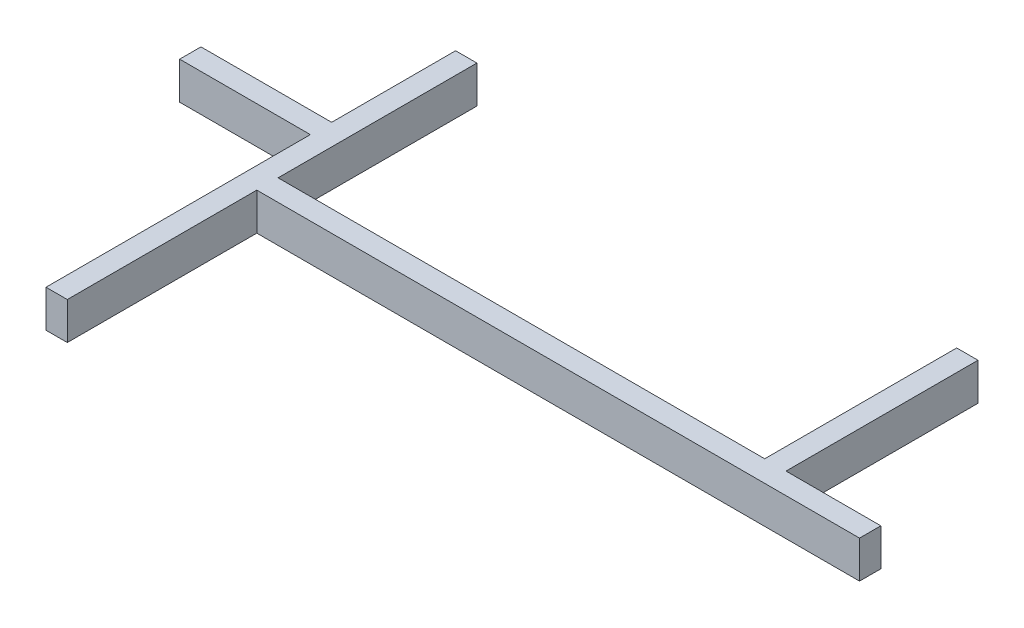
ISO-10303-21;
HEADER;
FILE_DESCRIPTION(('STEP AP214'),'2;1');
FILE_NAME('part.step','',(''),(''),'','','');
FILE_SCHEMA(('AUTOMOTIVE_DESIGN { 1 0 10303 214 1 1 1 1 }'));
ENDSEC;
DATA;
#1=APPLICATION_CONTEXT('core data for automotive mechanical design processes');
#2=APPLICATION_PROTOCOL_DEFINITION('international standard','automotive_design',2000,#1);
#3=PRODUCT_CONTEXT('',#1,'mechanical');
#4=PRODUCT('Part','Part','',(#3));
#5=PRODUCT_RELATED_PRODUCT_CATEGORY('part','',(#4));
#6=PRODUCT_DEFINITION_FORMATION('','',#4);
#7=PRODUCT_DEFINITION_CONTEXT('part definition',#1,'design');
#8=PRODUCT_DEFINITION('design','',#6,#7);
#9=PRODUCT_DEFINITION_SHAPE('','',#8);
#10=(LENGTH_UNIT() NAMED_UNIT(*) SI_UNIT(.MILLI.,.METRE.));
#11=(NAMED_UNIT(*) PLANE_ANGLE_UNIT() SI_UNIT($,.RADIAN.));
#12=(NAMED_UNIT(*) SI_UNIT($,.STERADIAN.) SOLID_ANGLE_UNIT());
#13=UNCERTAINTY_MEASURE_WITH_UNIT(LENGTH_MEASURE(1.E-05),#10,'distance_accuracy_value','');
#14=(GEOMETRIC_REPRESENTATION_CONTEXT(3) GLOBAL_UNCERTAINTY_ASSIGNED_CONTEXT((#13)) GLOBAL_UNIT_ASSIGNED_CONTEXT((#10,
#11,#12)) REPRESENTATION_CONTEXT('',''));
#15=CARTESIAN_POINT('',(0.,0.,0.));
#16=DIRECTION('',(0.,0.,1.));
#17=DIRECTION('',(1.,0.,0.));
#18=AXIS2_PLACEMENT_3D('',#15,#16,#17);
#19=CARTESIAN_POINT('',(69.8278514513272,8.5,104.418377476032));
#20=DIRECTION('',(0.,0.,-1.));
#21=DIRECTION('',(-1.,0.,0.));
#22=AXIS2_PLACEMENT_3D('',#19,#20,#21);
#23=PLANE('',#22);
#24=DIRECTION('',(1.,0.,0.));
#25=VECTOR('',#24,1.);
#26=CARTESIAN_POINT('',(69.8278514513272,1.5,104.418377476032));
#27=LINE('',#26,#25);
#28=CARTESIAN_POINT('',(-43.3451154340158,1.5,104.418377476032));
#29=VERTEX_POINT('',#28);
#30=CARTESIAN_POINT('',(69.8278514513272,1.5,104.418377476032));
#31=VERTEX_POINT('',#30);
#32=EDGE_CURVE('E252',#29,#31,#27,.T.);
#33=ORIENTED_EDGE('',*,*,#32,.T.);
#34=DIRECTION('',(0.,-1.,0.));
#35=VECTOR('',#34,1.);
#36=CARTESIAN_POINT('',(69.8278514513272,8.5,104.418377476032));
#37=LINE('',#36,#35);
#38=CARTESIAN_POINT('',(69.8278514513272,8.5,104.418377476032));
#39=VERTEX_POINT('',#38);
#40=EDGE_CURVE('E212',#39,#31,#37,.T.);
#41=ORIENTED_EDGE('',*,*,#40,.F.);
#42=DIRECTION('',(1.,0.,0.));
#43=VECTOR('',#42,1.);
#44=CARTESIAN_POINT('',(69.8278514513272,8.5,104.418377476032));
#45=LINE('',#44,#43);
#46=CARTESIAN_POINT('',(-43.3451154340158,8.5,104.418377476032));
#47=VERTEX_POINT('',#46);
#48=EDGE_CURVE('E222',#47,#39,#45,.T.);
#49=ORIENTED_EDGE('',*,*,#48,.F.);
#50=DIRECTION('',(0.,-1.,0.));
#51=VECTOR('',#50,1.);
#52=CARTESIAN_POINT('',(-43.3451154340158,8.5,104.418377476032));
#53=LINE('',#52,#51);
#54=EDGE_CURVE('E215',#47,#29,#53,.T.);
#55=ORIENTED_EDGE('',*,*,#54,.T.);
#56=EDGE_LOOP('',(#33,#41,#49,#55));
#57=FACE_BOUND('',#56,.T.);
#58=ADVANCED_FACE('F45',(#57),#23,.F.);
#59=CARTESIAN_POINT('',(69.8278514513266,8.5,100.418377476032));
#60=DIRECTION('',(-1.,0.,1.31838984174237E-13));
#61=DIRECTION('',(1.31838984174237E-13,0.,1.));
#62=AXIS2_PLACEMENT_3D('',#59,#60,#61);
#63=PLANE('',#62);
#64=DIRECTION('',(-1.31838984174237E-13,0.,-1.));
#65=VECTOR('',#64,1.);
#66=CARTESIAN_POINT('',(69.8278514513266,1.5,100.418377476032));
#67=LINE('',#66,#65);
#68=CARTESIAN_POINT('',(69.8278514513266,1.5,100.418377476032));
#69=VERTEX_POINT('',#68);
#70=EDGE_CURVE('E255',#31,#69,#67,.T.);
#71=ORIENTED_EDGE('',*,*,#70,.T.);
#72=DIRECTION('',(0.,-1.,0.));
#73=VECTOR('',#72,1.);
#74=CARTESIAN_POINT('',(69.8278514513266,8.5,100.418377476032));
#75=LINE('',#74,#73);
#76=CARTESIAN_POINT('',(69.8278514513266,8.5,100.418377476032));
#77=VERTEX_POINT('',#76);
#78=EDGE_CURVE('E209',#77,#69,#75,.T.);
#79=ORIENTED_EDGE('',*,*,#78,.F.);
#80=DIRECTION('',(-1.31838984174237E-13,0.,-1.));
#81=VECTOR('',#80,1.);
#82=CARTESIAN_POINT('',(69.8278514513266,8.5,100.418377476032));
#83=LINE('',#82,#81);
#84=EDGE_CURVE('E228',#39,#77,#83,.T.);
#85=ORIENTED_EDGE('',*,*,#84,.F.);
#86=ORIENTED_EDGE('',*,*,#40,.T.);
#87=EDGE_LOOP('',(#71,#79,#85,#86));
#88=FACE_BOUND('',#87,.T.);
#89=ADVANCED_FACE('F332',(#88),#63,.F.);
#90=CARTESIAN_POINT('',(52.0277518293071,8.5,100.418377476032));
#91=DIRECTION('',(0.,0.,1.));
#92=DIRECTION('',(1.,0.,0.));
#93=AXIS2_PLACEMENT_3D('',#90,#91,#92);
#94=PLANE('',#93);
#95=DIRECTION('',(-1.,0.,0.));
#96=VECTOR('',#95,1.);
#97=CARTESIAN_POINT('',(52.0277518293071,1.5,100.418377476032));
#98=LINE('',#97,#96);
#99=CARTESIAN_POINT('',(52.0277518293071,1.5,100.418377476032));
#100=VERTEX_POINT('',#99);
#101=EDGE_CURVE('E258',#69,#100,#98,.T.);
#102=ORIENTED_EDGE('',*,*,#101,.T.);
#103=DIRECTION('',(0.,-1.,0.));
#104=VECTOR('',#103,1.);
#105=CARTESIAN_POINT('',(52.0277518293071,8.5,100.418377476032));
#106=LINE('',#105,#104);
#107=CARTESIAN_POINT('',(52.0277518293071,8.5,100.418377476032));
#108=VERTEX_POINT('',#107);
#109=EDGE_CURVE('E206',#108,#100,#106,.T.);
#110=ORIENTED_EDGE('',*,*,#109,.F.);
#111=DIRECTION('',(-1.,0.,0.));
#112=VECTOR('',#111,1.);
#113=CARTESIAN_POINT('',(52.0277518293071,8.5,100.418377476032));
#114=LINE('',#113,#112);
#115=EDGE_CURVE('E230',#77,#108,#114,.T.);
#116=ORIENTED_EDGE('',*,*,#115,.F.);
#117=ORIENTED_EDGE('',*,*,#78,.T.);
#118=EDGE_LOOP('',(#102,#110,#116,#117));
#119=FACE_BOUND('',#118,.T.);
#120=ADVANCED_FACE('F329',(#119),#94,.F.);
#121=CARTESIAN_POINT('',(52.0277518293071,8.5,64.3719394552487));
#122=DIRECTION('',(-1.,0.,0.));
#123=DIRECTION('',(0.,0.,1.));
#124=AXIS2_PLACEMENT_3D('',#121,#122,#123);
#125=PLANE('',#124);
#126=DIRECTION('',(0.,0.,-1.));
#127=VECTOR('',#126,1.);
#128=CARTESIAN_POINT('',(52.0277518293071,1.5,64.3719394552487));
#129=LINE('',#128,#127);
#130=CARTESIAN_POINT('',(52.0277518293071,1.5,64.3719394552487));
#131=VERTEX_POINT('',#130);
#132=EDGE_CURVE('E261',#100,#131,#129,.T.);
#133=ORIENTED_EDGE('',*,*,#132,.T.);
#134=DIRECTION('',(0.,-1.,0.));
#135=VECTOR('',#134,1.);
#136=CARTESIAN_POINT('',(52.0277518293071,8.5,64.3719394552487));
#137=LINE('',#136,#135);
#138=CARTESIAN_POINT('',(52.0277518293071,8.5,64.3719394552487));
#139=VERTEX_POINT('',#138);
#140=EDGE_CURVE('E203',#139,#131,#137,.T.);
#141=ORIENTED_EDGE('',*,*,#140,.F.);
#142=DIRECTION('',(0.,0.,-1.));
#143=VECTOR('',#142,1.);
#144=CARTESIAN_POINT('',(52.0277518293071,8.5,64.3719394552487));
#145=LINE('',#144,#143);
#146=EDGE_CURVE('E232',#108,#139,#145,.T.);
#147=ORIENTED_EDGE('',*,*,#146,.F.);
#148=ORIENTED_EDGE('',*,*,#109,.T.);
#149=EDGE_LOOP('',(#133,#141,#147,#148));
#150=FACE_BOUND('',#149,.T.);
#151=ADVANCED_FACE('F324',(#150),#125,.F.);
#152=CARTESIAN_POINT('',(48.0277518293071,8.5,64.3719394552487));
#153=DIRECTION('',(0.,0.,1.));
#154=DIRECTION('',(1.,0.,0.));
#155=AXIS2_PLACEMENT_3D('',#152,#153,#154);
#156=PLANE('',#155);
#157=DIRECTION('',(-1.,0.,0.));
#158=VECTOR('',#157,1.);
#159=CARTESIAN_POINT('',(48.0277518293071,1.5,64.3719394552487));
#160=LINE('',#159,#158);
#161=CARTESIAN_POINT('',(48.0277518293071,1.5,64.3719394552487));
#162=VERTEX_POINT('',#161);
#163=EDGE_CURVE('E264',#131,#162,#160,.T.);
#164=ORIENTED_EDGE('',*,*,#163,.T.);
#165=DIRECTION('',(0.,-1.,0.));
#166=VECTOR('',#165,1.);
#167=CARTESIAN_POINT('',(48.0277518293071,8.5,64.3719394552487));
#168=LINE('',#167,#166);
#169=CARTESIAN_POINT('',(48.0277518293071,8.5,64.3719394552487));
#170=VERTEX_POINT('',#169);
#171=EDGE_CURVE('E200',#170,#162,#168,.T.);
#172=ORIENTED_EDGE('',*,*,#171,.F.);
#173=DIRECTION('',(-1.,0.,0.));
#174=VECTOR('',#173,1.);
#175=CARTESIAN_POINT('',(48.0277518293071,8.5,64.3719394552487));
#176=LINE('',#175,#174);
#177=EDGE_CURVE('E234',#139,#170,#176,.T.);
#178=ORIENTED_EDGE('',*,*,#177,.F.);
#179=ORIENTED_EDGE('',*,*,#140,.T.);
#180=EDGE_LOOP('',(#164,#172,#178,#179));
#181=FACE_BOUND('',#180,.T.);
#182=ADVANCED_FACE('F321',(#181),#156,.F.);
#183=CARTESIAN_POINT('',(48.0277518293071,8.5,100.418377476032));
#184=DIRECTION('',(1.,0.,0.));
#185=DIRECTION('',(0.,0.,-1.));
#186=AXIS2_PLACEMENT_3D('',#183,#184,#185);
#187=PLANE('',#186);
#188=DIRECTION('',(0.,0.,1.));
#189=VECTOR('',#188,1.);
#190=CARTESIAN_POINT('',(48.0277518293071,1.5,100.418377476032));
#191=LINE('',#190,#189);
#192=CARTESIAN_POINT('',(48.0277518293071,1.5,100.418377476032));
#193=VERTEX_POINT('',#192);
#194=EDGE_CURVE('E267',#162,#193,#191,.T.);
#195=ORIENTED_EDGE('',*,*,#194,.T.);
#196=DIRECTION('',(0.,-1.,0.));
#197=VECTOR('',#196,1.);
#198=CARTESIAN_POINT('',(48.0277518293071,8.5,100.418377476032));
#199=LINE('',#198,#197);
#200=CARTESIAN_POINT('',(48.0277518293071,8.5,100.418377476032));
#201=VERTEX_POINT('',#200);
#202=EDGE_CURVE('E197',#201,#193,#199,.T.);
#203=ORIENTED_EDGE('',*,*,#202,.F.);
#204=DIRECTION('',(0.,0.,1.));
#205=VECTOR('',#204,1.);
#206=CARTESIAN_POINT('',(48.0277518293071,8.5,100.418377476032));
#207=LINE('',#206,#205);
#208=EDGE_CURVE('E236',#170,#201,#207,.T.);
#209=ORIENTED_EDGE('',*,*,#208,.F.);
#210=ORIENTED_EDGE('',*,*,#171,.T.);
#211=EDGE_LOOP('',(#195,#203,#209,#210));
#212=FACE_BOUND('',#211,.T.);
#213=ADVANCED_FACE('F316',(#212),#187,.F.);
#214=CARTESIAN_POINT('',(-43.3451154340158,8.5,100.418377476032));
#215=DIRECTION('',(0.,0.,1.));
#216=DIRECTION('',(1.,0.,0.));
#217=AXIS2_PLACEMENT_3D('',#214,#215,#216);
#218=PLANE('',#217);
#219=DIRECTION('',(-1.,0.,0.));
#220=VECTOR('',#219,1.);
#221=CARTESIAN_POINT('',(-43.3451154340158,1.5,100.418377476032));
#222=LINE('',#221,#220);
#223=CARTESIAN_POINT('',(-43.3451154340158,1.5,100.418377476032));
#224=VERTEX_POINT('',#223);
#225=EDGE_CURVE('E270',#193,#224,#222,.T.);
#226=ORIENTED_EDGE('',*,*,#225,.T.);
#227=DIRECTION('',(0.,-1.,0.));
#228=VECTOR('',#227,1.);
#229=CARTESIAN_POINT('',(-43.3451154340158,8.5,100.418377476032));
#230=LINE('',#229,#228);
#231=CARTESIAN_POINT('',(-43.3451154340158,8.5,100.418377476032));
#232=VERTEX_POINT('',#231);
#233=EDGE_CURVE('E194',#232,#224,#230,.T.);
#234=ORIENTED_EDGE('',*,*,#233,.F.);
#235=DIRECTION('',(-1.,0.,0.));
#236=VECTOR('',#235,1.);
#237=CARTESIAN_POINT('',(-43.3451154340158,8.5,100.418377476032));
#238=LINE('',#237,#236);
#239=EDGE_CURVE('E238',#201,#232,#238,.T.);
#240=ORIENTED_EDGE('',*,*,#239,.F.);
#241=ORIENTED_EDGE('',*,*,#202,.T.);
#242=EDGE_LOOP('',(#226,#234,#240,#241));
#243=FACE_BOUND('',#242,.T.);
#244=ADVANCED_FACE('F313',(#243),#218,.F.);
#245=CARTESIAN_POINT('',(-43.3451154340158,8.5,63.0885592077101));
#246=DIRECTION('',(-1.,0.,0.));
#247=DIRECTION('',(0.,0.,1.));
#248=AXIS2_PLACEMENT_3D('',#245,#246,#247);
#249=PLANE('',#248);
#250=DIRECTION('',(0.,0.,-1.));
#251=VECTOR('',#250,1.);
#252=CARTESIAN_POINT('',(-43.3451154340158,1.5,63.0885592077101));
#253=LINE('',#252,#251);
#254=CARTESIAN_POINT('',(-43.3451154340158,1.5,63.0885592077101));
#255=VERTEX_POINT('',#254);
#256=EDGE_CURVE('E273',#224,#255,#253,.T.);
#257=ORIENTED_EDGE('',*,*,#256,.T.);
#258=DIRECTION('',(0.,-1.,0.));
#259=VECTOR('',#258,1.);
#260=CARTESIAN_POINT('',(-43.3451154340158,8.5,63.0885592077101));
#261=LINE('',#260,#259);
#262=CARTESIAN_POINT('',(-43.3451154340158,8.5,63.0885592077101));
#263=VERTEX_POINT('',#262);
#264=EDGE_CURVE('E191',#263,#255,#261,.T.);
#265=ORIENTED_EDGE('',*,*,#264,.F.);
#266=DIRECTION('',(0.,0.,-1.));
#267=VECTOR('',#266,1.);
#268=CARTESIAN_POINT('',(-43.3451154340158,8.5,63.0885592077101));
#269=LINE('',#268,#267);
#270=EDGE_CURVE('E240',#232,#263,#269,.T.);
#271=ORIENTED_EDGE('',*,*,#270,.F.);
#272=ORIENTED_EDGE('',*,*,#233,.T.);
#273=EDGE_LOOP('',(#257,#265,#271,#272));
#274=FACE_BOUND('',#273,.T.);
#275=ADVANCED_FACE('F308',(#274),#249,.F.);
#276=CARTESIAN_POINT('',(-47.3451154340158,8.5,63.0885592077101));
#277=DIRECTION('',(0.,0.,1.));
#278=DIRECTION('',(1.,0.,0.));
#279=AXIS2_PLACEMENT_3D('',#276,#277,#278);
#280=PLANE('',#279);
#281=DIRECTION('',(-1.,0.,0.));
#282=VECTOR('',#281,1.);
#283=CARTESIAN_POINT('',(-47.3451154340158,1.5,63.0885592077101));
#284=LINE('',#283,#282);
#285=CARTESIAN_POINT('',(-47.3451154340158,1.5,63.0885592077101));
#286=VERTEX_POINT('',#285);
#287=EDGE_CURVE('E276',#255,#286,#284,.T.);
#288=ORIENTED_EDGE('',*,*,#287,.T.);
#289=DIRECTION('',(0.,-1.,0.));
#290=VECTOR('',#289,1.);
#291=CARTESIAN_POINT('',(-47.3451154340158,8.5,63.0885592077101));
#292=LINE('',#291,#290);
#293=CARTESIAN_POINT('',(-47.3451154340158,8.5,63.0885592077101));
#294=VERTEX_POINT('',#293);
#295=EDGE_CURVE('E188',#294,#286,#292,.T.);
#296=ORIENTED_EDGE('',*,*,#295,.F.);
#297=DIRECTION('',(-1.,0.,0.));
#298=VECTOR('',#297,1.);
#299=CARTESIAN_POINT('',(-47.3451154340158,8.5,63.0885592077101));
#300=LINE('',#299,#298);
#301=EDGE_CURVE('E242',#263,#294,#300,.T.);
#302=ORIENTED_EDGE('',*,*,#301,.F.);
#303=ORIENTED_EDGE('',*,*,#264,.T.);
#304=EDGE_LOOP('',(#288,#296,#302,#303));
#305=FACE_BOUND('',#304,.T.);
#306=ADVANCED_FACE('F305',(#305),#280,.F.);
#307=CARTESIAN_POINT('',(-47.3451154340158,8.5,86.3645578905481));
#308=DIRECTION('',(1.,0.,0.));
#309=DIRECTION('',(0.,0.,-1.));
#310=AXIS2_PLACEMENT_3D('',#307,#308,#309);
#311=PLANE('',#310);
#312=DIRECTION('',(0.,0.,1.));
#313=VECTOR('',#312,1.);
#314=CARTESIAN_POINT('',(-47.3451154340158,1.5,86.3645578905481));
#315=LINE('',#314,#313);
#316=CARTESIAN_POINT('',(-47.3451154340158,1.5,86.3645578905481));
#317=VERTEX_POINT('',#316);
#318=EDGE_CURVE('E279',#286,#317,#315,.T.);
#319=ORIENTED_EDGE('',*,*,#318,.T.);
#320=DIRECTION('',(0.,-1.,0.));
#321=VECTOR('',#320,1.);
#322=CARTESIAN_POINT('',(-47.3451154340158,8.5,86.3645578905481));
#323=LINE('',#322,#321);
#324=CARTESIAN_POINT('',(-47.3451154340158,8.5,86.3645578905481));
#325=VERTEX_POINT('',#324);
#326=EDGE_CURVE('E185',#325,#317,#323,.T.);
#327=ORIENTED_EDGE('',*,*,#326,.F.);
#328=DIRECTION('',(0.,0.,1.));
#329=VECTOR('',#328,1.);
#330=CARTESIAN_POINT('',(-47.3451154340158,8.5,86.3645578905481));
#331=LINE('',#330,#329);
#332=EDGE_CURVE('E244',#294,#325,#331,.T.);
#333=ORIENTED_EDGE('',*,*,#332,.F.);
#334=ORIENTED_EDGE('',*,*,#295,.T.);
#335=EDGE_LOOP('',(#319,#327,#333,#334));
#336=FACE_BOUND('',#335,.T.);
#337=ADVANCED_FACE('F300',(#336),#311,.F.);
#338=CARTESIAN_POINT('',(-71.881878867136,8.5,86.3645578905481));
#339=DIRECTION('',(0.,0.,1.));
#340=DIRECTION('',(1.,0.,0.));
#341=AXIS2_PLACEMENT_3D('',#338,#339,#340);
#342=PLANE('',#341);
#343=DIRECTION('',(-1.,0.,0.));
#344=VECTOR('',#343,1.);
#345=CARTESIAN_POINT('',(-71.881878867136,1.5,86.3645578905481));
#346=LINE('',#345,#344);
#347=CARTESIAN_POINT('',(-71.881878867136,1.5,86.3645578905481));
#348=VERTEX_POINT('',#347);
#349=EDGE_CURVE('E282',#317,#348,#346,.T.);
#350=ORIENTED_EDGE('',*,*,#349,.T.);
#351=DIRECTION('',(0.,-1.,0.));
#352=VECTOR('',#351,1.);
#353=CARTESIAN_POINT('',(-71.881878867136,8.5,86.3645578905481));
#354=LINE('',#353,#352);
#355=CARTESIAN_POINT('',(-71.881878867136,8.5,86.3645578905481));
#356=VERTEX_POINT('',#355);
#357=EDGE_CURVE('E182',#356,#348,#354,.T.);
#358=ORIENTED_EDGE('',*,*,#357,.F.);
#359=DIRECTION('',(-1.,0.,0.));
#360=VECTOR('',#359,1.);
#361=CARTESIAN_POINT('',(-71.881878867136,8.5,86.3645578905481));
#362=LINE('',#361,#360);
#363=EDGE_CURVE('E246',#325,#356,#362,.T.);
#364=ORIENTED_EDGE('',*,*,#363,.F.);
#365=ORIENTED_EDGE('',*,*,#326,.T.);
#366=EDGE_LOOP('',(#350,#358,#364,#365));
#367=FACE_BOUND('',#366,.T.);
#368=ADVANCED_FACE('F297',(#367),#342,.F.);
#369=CARTESIAN_POINT('',(-71.881878867136,8.5,90.3645578905481));
#370=DIRECTION('',(1.,0.,0.));
#371=DIRECTION('',(0.,0.,-1.));
#372=AXIS2_PLACEMENT_3D('',#369,#370,#371);
#373=PLANE('',#372);
#374=DIRECTION('',(0.,0.,1.));
#375=VECTOR('',#374,1.);
#376=CARTESIAN_POINT('',(-71.881878867136,1.5,90.3645578905481));
#377=LINE('',#376,#375);
#378=CARTESIAN_POINT('',(-71.881878867136,1.5,90.3645578905481));
#379=VERTEX_POINT('',#378);
#380=EDGE_CURVE('E285',#348,#379,#377,.T.);
#381=ORIENTED_EDGE('',*,*,#380,.T.);
#382=DIRECTION('',(0.,-1.,0.));
#383=VECTOR('',#382,1.);
#384=CARTESIAN_POINT('',(-71.881878867136,8.5,90.3645578905481));
#385=LINE('',#384,#383);
#386=CARTESIAN_POINT('',(-71.881878867136,8.5,90.3645578905481));
#387=VERTEX_POINT('',#386);
#388=EDGE_CURVE('E174',#387,#379,#385,.T.);
#389=ORIENTED_EDGE('',*,*,#388,.F.);
#390=DIRECTION('',(0.,0.,1.));
#391=VECTOR('',#390,1.);
#392=CARTESIAN_POINT('',(-71.881878867136,8.5,90.3645578905481));
#393=LINE('',#392,#391);
#394=EDGE_CURVE('E248',#356,#387,#393,.T.);
#395=ORIENTED_EDGE('',*,*,#394,.F.);
#396=ORIENTED_EDGE('',*,*,#357,.T.);
#397=EDGE_LOOP('',(#381,#389,#395,#396));
#398=FACE_BOUND('',#397,.T.);
#399=ADVANCED_FACE('F292',(#398),#373,.F.);
#400=CARTESIAN_POINT('',(-47.3451154340158,8.5,90.3645578905481));
#401=DIRECTION('',(0.,0.,-1.));
#402=DIRECTION('',(-1.,0.,0.));
#403=AXIS2_PLACEMENT_3D('',#400,#401,#402);
#404=PLANE('',#403);
#405=DIRECTION('',(1.,0.,0.));
#406=VECTOR('',#405,1.);
#407=CARTESIAN_POINT('',(-47.3451154340158,1.5,90.3645578905481));
#408=LINE('',#407,#406);
#409=CARTESIAN_POINT('',(-47.3451154340158,1.5,90.3645578905481));
#410=VERTEX_POINT('',#409);
#411=EDGE_CURVE('E171',#379,#410,#408,.T.);
#412=ORIENTED_EDGE('',*,*,#411,.T.);
#413=DIRECTION('',(0.,-1.,0.));
#414=VECTOR('',#413,1.);
#415=CARTESIAN_POINT('',(-47.3451154340158,8.5,90.3645578905481));
#416=LINE('',#415,#414);
#417=CARTESIAN_POINT('',(-47.3451154340158,8.5,90.3645578905481));
#418=VERTEX_POINT('',#417);
#419=EDGE_CURVE('E169',#418,#410,#416,.T.);
#420=ORIENTED_EDGE('',*,*,#419,.F.);
#421=DIRECTION('',(1.,0.,0.));
#422=VECTOR('',#421,1.);
#423=CARTESIAN_POINT('',(-47.3451154340158,8.5,90.3645578905481));
#424=LINE('',#423,#422);
#425=EDGE_CURVE('E176',#387,#418,#424,.T.);
#426=ORIENTED_EDGE('',*,*,#425,.F.);
#427=ORIENTED_EDGE('',*,*,#388,.T.);
#428=EDGE_LOOP('',(#412,#420,#426,#427));
#429=FACE_BOUND('',#428,.T.);
#430=ADVANCED_FACE('F288',(#429),#404,.F.);
#431=CARTESIAN_POINT('',(-47.3451154340158,8.5,140.));
#432=DIRECTION('',(1.,0.,0.));
#433=DIRECTION('',(0.,0.,-1.));
#434=AXIS2_PLACEMENT_3D('',#431,#432,#433);
#435=PLANE('',#434);
#436=DIRECTION('',(0.,0.,1.));
#437=VECTOR('',#436,1.);
#438=CARTESIAN_POINT('',(-47.3451154340158,1.5,140.));
#439=LINE('',#438,#437);
#440=CARTESIAN_POINT('',(-47.3451154340158,1.5,140.));
#441=VERTEX_POINT('',#440);
#442=EDGE_CURVE('E155',#410,#441,#439,.T.);
#443=ORIENTED_EDGE('',*,*,#442,.T.);
#444=DIRECTION('',(0.,-1.,0.));
#445=VECTOR('',#444,1.);
#446=CARTESIAN_POINT('',(-47.3451154340158,8.5,140.));
#447=LINE('',#446,#445);
#448=CARTESIAN_POINT('',(-47.3451154340158,8.5,140.));
#449=VERTEX_POINT('',#448);
#450=EDGE_CURVE('E166',#449,#441,#447,.T.);
#451=ORIENTED_EDGE('',*,*,#450,.F.);
#452=DIRECTION('',(0.,0.,1.));
#453=VECTOR('',#452,1.);
#454=CARTESIAN_POINT('',(-47.3451154340158,8.5,140.));
#455=LINE('',#454,#453);
#456=EDGE_CURVE('E61',#418,#449,#455,.T.);
#457=ORIENTED_EDGE('',*,*,#456,.F.);
#458=ORIENTED_EDGE('',*,*,#419,.T.);
#459=EDGE_LOOP('',(#443,#451,#457,#458));
#460=FACE_BOUND('',#459,.T.);
#461=ADVANCED_FACE('F165',(#460),#435,.F.);
#462=CARTESIAN_POINT('',(0.,8.5,0.));
#463=DIRECTION('',(0.,-1.,0.));
#464=DIRECTION('',(0.,0.,-1.));
#465=AXIS2_PLACEMENT_3D('',#462,#463,#464);
#466=PLANE('',#465);
#467=DIRECTION('',(1.,0.,0.));
#468=VECTOR('',#467,1.);
#469=CARTESIAN_POINT('',(-43.3451154340158,8.5,140.));
#470=LINE('',#469,#468);
#471=CARTESIAN_POINT('',(-43.3451154340158,8.5,140.));
#472=VERTEX_POINT('',#471);
#473=EDGE_CURVE('E170',#449,#472,#470,.T.);
#474=ORIENTED_EDGE('',*,*,#473,.T.);
#475=DIRECTION('',(0.,0.,-1.));
#476=VECTOR('',#475,1.);
#477=CARTESIAN_POINT('',(-43.3451154340158,8.5,104.418377476032));
#478=LINE('',#477,#476);
#479=EDGE_CURVE('E220',#472,#47,#478,.T.);
#480=ORIENTED_EDGE('',*,*,#479,.T.);
#481=ORIENTED_EDGE('',*,*,#48,.T.);
#482=ORIENTED_EDGE('',*,*,#84,.T.);
#483=ORIENTED_EDGE('',*,*,#115,.T.);
#484=ORIENTED_EDGE('',*,*,#146,.T.);
#485=ORIENTED_EDGE('',*,*,#177,.T.);
#486=ORIENTED_EDGE('',*,*,#208,.T.);
#487=ORIENTED_EDGE('',*,*,#239,.T.);
#488=ORIENTED_EDGE('',*,*,#270,.T.);
#489=ORIENTED_EDGE('',*,*,#301,.T.);
#490=ORIENTED_EDGE('',*,*,#332,.T.);
#491=ORIENTED_EDGE('',*,*,#363,.T.);
#492=ORIENTED_EDGE('',*,*,#394,.T.);
#493=ORIENTED_EDGE('',*,*,#425,.T.);
#494=ORIENTED_EDGE('',*,*,#456,.T.);
#495=EDGE_LOOP('',(#474,#480,#481,#482,#483,#484,#485,#486,#487,#488,#489,#490,#491,#492,#493,#494));
#496=FACE_BOUND('',#495,.T.);
#497=ADVANCED_FACE('F224',(#496),#466,.F.);
#498=CARTESIAN_POINT('',(-43.3451154340158,8.5,104.418377476032));
#499=DIRECTION('',(-1.,0.,0.));
#500=DIRECTION('',(0.,0.,1.));
#501=AXIS2_PLACEMENT_3D('',#498,#499,#500);
#502=PLANE('',#501);
#503=DIRECTION('',(0.,0.,-1.));
#504=VECTOR('',#503,1.);
#505=CARTESIAN_POINT('',(-43.3451154340158,1.5,104.418377476032));
#506=LINE('',#505,#504);
#507=CARTESIAN_POINT('',(-43.3451154340158,1.5,140.));
#508=VERTEX_POINT('',#507);
#509=EDGE_CURVE('E158',#508,#29,#506,.T.);
#510=ORIENTED_EDGE('',*,*,#509,.T.);
#511=ORIENTED_EDGE('',*,*,#54,.F.);
#512=ORIENTED_EDGE('',*,*,#479,.F.);
#513=DIRECTION('',(0.,-1.,0.));
#514=VECTOR('',#513,1.);
#515=CARTESIAN_POINT('',(-43.3451154340158,8.5,140.));
#516=LINE('',#515,#514);
#517=EDGE_CURVE('E54',#472,#508,#516,.T.);
#518=ORIENTED_EDGE('',*,*,#517,.T.);
#519=EDGE_LOOP('',(#510,#511,#512,#518));
#520=FACE_BOUND('',#519,.T.);
#521=ADVANCED_FACE('F218',(#520),#502,.F.);
#522=CARTESIAN_POINT('',(140.,1.5,140.));
#523=DIRECTION('',(0.,0.,-1.));
#524=DIRECTION('',(-1.,0.,0.));
#525=AXIS2_PLACEMENT_3D('',#522,#523,#524);
#526=PLANE('',#525);
#527=ORIENTED_EDGE('',*,*,#450,.T.);
#528=DIRECTION('',(1.,0.,0.));
#529=VECTOR('',#528,1.);
#530=CARTESIAN_POINT('',(140.,1.5,140.));
#531=LINE('',#530,#529);
#532=EDGE_CURVE('E11',#441,#508,#531,.T.);
#533=ORIENTED_EDGE('',*,*,#532,.T.);
#534=ORIENTED_EDGE('',*,*,#517,.F.);
#535=ORIENTED_EDGE('',*,*,#473,.F.);
#536=EDGE_LOOP('',(#527,#533,#534,#535));
#537=FACE_BOUND('',#536,.T.);
#538=ADVANCED_FACE('F47',(#537),#526,.F.);
#539=CARTESIAN_POINT('',(-74.1819559113916,1.5,55.));
#540=DIRECTION('',(0.,1.,0.));
#541=DIRECTION('',(0.,0.,1.));
#542=AXIS2_PLACEMENT_3D('',#539,#540,#541);
#543=PLANE('',#542);
#544=ORIENTED_EDGE('',*,*,#411,.F.);
#545=ORIENTED_EDGE('',*,*,#380,.F.);
#546=ORIENTED_EDGE('',*,*,#349,.F.);
#547=ORIENTED_EDGE('',*,*,#318,.F.);
#548=ORIENTED_EDGE('',*,*,#287,.F.);
#549=ORIENTED_EDGE('',*,*,#256,.F.);
#550=ORIENTED_EDGE('',*,*,#225,.F.);
#551=ORIENTED_EDGE('',*,*,#194,.F.);
#552=ORIENTED_EDGE('',*,*,#163,.F.);
#553=ORIENTED_EDGE('',*,*,#132,.F.);
#554=ORIENTED_EDGE('',*,*,#101,.F.);
#555=ORIENTED_EDGE('',*,*,#70,.F.);
#556=ORIENTED_EDGE('',*,*,#32,.F.);
#557=ORIENTED_EDGE('',*,*,#509,.F.);
#558=ORIENTED_EDGE('',*,*,#532,.F.);
#559=ORIENTED_EDGE('',*,*,#442,.F.);
#560=EDGE_LOOP('',(#544,#545,#546,#547,#548,#549,#550,#551,#552,#553,#554,#555,#556,#557,#558,#559));
#561=FACE_BOUND('',#560,.T.);
#562=ADVANCED_FACE('F154',(#561),#543,.F.);
#563=CLOSED_SHELL('',(#58,#89,#120,#151,#182,#213,#244,#275,#306,#337,#368,#399,#430,#461,#497,
#521,#538,#562));
#564=MANIFOLD_SOLID_BREP('B2',#563);
#565=ADVANCED_BREP_SHAPE_REPRESENTATION('',(#18,#564),#14);
#566=SHAPE_DEFINITION_REPRESENTATION(#9,#565);
ENDSEC;
END-ISO-10303-21;
